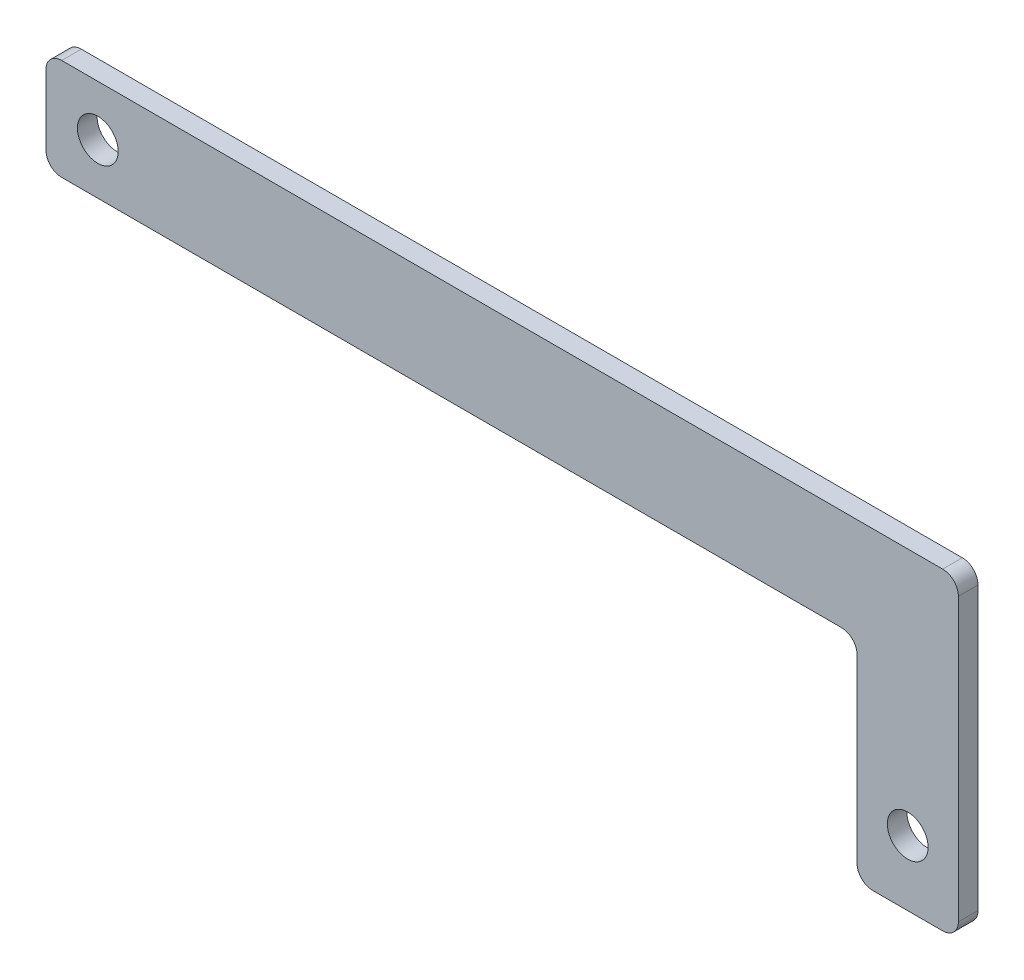
ISO-10303-21;
HEADER;
FILE_DESCRIPTION(('STEP AP214'),'2;1');
FILE_NAME('part.step','',(''),(''),'','','');
FILE_SCHEMA(('AUTOMOTIVE_DESIGN { 1 0 10303 214 1 1 1 1 }'));
ENDSEC;
DATA;
#1=APPLICATION_CONTEXT('core data for automotive mechanical design processes');
#2=APPLICATION_PROTOCOL_DEFINITION('international standard','automotive_design',2000,#1);
#3=PRODUCT_CONTEXT('',#1,'mechanical');
#4=PRODUCT('Part','Part','',(#3));
#5=PRODUCT_RELATED_PRODUCT_CATEGORY('part','',(#4));
#6=PRODUCT_DEFINITION_FORMATION('','',#4);
#7=PRODUCT_DEFINITION_CONTEXT('part definition',#1,'design');
#8=PRODUCT_DEFINITION('design','',#6,#7);
#9=PRODUCT_DEFINITION_SHAPE('','',#8);
#10=(LENGTH_UNIT() NAMED_UNIT(*) SI_UNIT(.MILLI.,.METRE.));
#11=(NAMED_UNIT(*) PLANE_ANGLE_UNIT() SI_UNIT($,.RADIAN.));
#12=(NAMED_UNIT(*) SI_UNIT($,.STERADIAN.) SOLID_ANGLE_UNIT());
#13=UNCERTAINTY_MEASURE_WITH_UNIT(LENGTH_MEASURE(1.E-05),#10,'distance_accuracy_value','');
#14=(GEOMETRIC_REPRESENTATION_CONTEXT(3) GLOBAL_UNCERTAINTY_ASSIGNED_CONTEXT((#13)) GLOBAL_UNIT_ASSIGNED_CONTEXT((#10,
#11,#12)) REPRESENTATION_CONTEXT('',''));
#15=CARTESIAN_POINT('',(0.,0.,0.));
#16=DIRECTION('',(0.,0.,1.));
#17=DIRECTION('',(1.,0.,0.));
#18=AXIS2_PLACEMENT_3D('',#15,#16,#17);
#19=CARTESIAN_POINT('',(-22.7939000000006,-78.501600001231,-3.175));
#20=DIRECTION('',(-1.,0.,0.));
#21=DIRECTION('',(0.,-1.,0.));
#22=AXIS2_PLACEMENT_3D('',#19,#20,#21);
#23=PLANE('',#22);
#24=DIRECTION('',(0.,-1.,0.));
#25=VECTOR('',#24,1.);
#26=CARTESIAN_POINT('',(-22.7939000000006,-78.501600001231,0.));
#27=LINE('',#26,#25);
#28=CARTESIAN_POINT('',(-22.7939000000006,-64.663600001231,0.));
#29=VERTEX_POINT('',#28);
#30=CARTESIAN_POINT('',(-22.7939000000006,-75.961600001231,0.));
#31=VERTEX_POINT('',#30);
#32=EDGE_CURVE('E232',#29,#31,#27,.T.);
#33=ORIENTED_EDGE('',*,*,#32,.F.);
#34=DIRECTION('',(0.,0.,1.));
#35=VECTOR('',#34,1.);
#36=CARTESIAN_POINT('',(-22.7939000000006,-64.663600001231,-3.175));
#37=LINE('',#36,#35);
#38=CARTESIAN_POINT('',(-22.7939000000006,-64.663600001231,-3.175));
#39=VERTEX_POINT('',#38);
#40=EDGE_CURVE('E202',#29,#39,#37,.F.);
#41=ORIENTED_EDGE('',*,*,#40,.T.);
#42=DIRECTION('',(0.,-1.,0.));
#43=VECTOR('',#42,1.);
#44=CARTESIAN_POINT('',(-22.7939000000006,-78.501600001231,-3.175));
#45=LINE('',#44,#43);
#46=CARTESIAN_POINT('',(-22.7939000000006,-75.961600001231,-3.175));
#47=VERTEX_POINT('',#46);
#48=EDGE_CURVE('E221',#39,#47,#45,.T.);
#49=ORIENTED_EDGE('',*,*,#48,.T.);
#50=DIRECTION('',(0.,0.,1.));
#51=VECTOR('',#50,1.);
#52=CARTESIAN_POINT('',(-22.7939000000006,-75.961600001231,-3.175));
#53=LINE('',#52,#51);
#54=EDGE_CURVE('E199',#47,#31,#53,.T.);
#55=ORIENTED_EDGE('',*,*,#54,.T.);
#56=EDGE_LOOP('',(#33,#41,#49,#55));
#57=FACE_BOUND('',#56,.T.);
#58=ADVANCED_FACE('F43',(#57),#23,.T.);
#59=CARTESIAN_POINT('',(124.749719047619,-62.123600001232,-3.175));
#60=DIRECTION('',(0.,1.,0.));
#61=DIRECTION('',(-1.,0.,0.));
#62=AXIS2_PLACEMENT_3D('',#59,#60,#61);
#63=PLANE('',#62);
#64=DIRECTION('',(-1.,0.,0.));
#65=VECTOR('',#64,1.);
#66=CARTESIAN_POINT('',(124.749719047619,-62.123600001232,0.));
#67=LINE('',#66,#65);
#68=CARTESIAN_POINT('',(122.209719047619,-62.123600001232,0.));
#69=VERTEX_POINT('',#68);
#70=CARTESIAN_POINT('',(-20.2539000000005,-62.123600001231,0.));
#71=VERTEX_POINT('',#70);
#72=EDGE_CURVE('E153',#69,#71,#67,.T.);
#73=ORIENTED_EDGE('',*,*,#72,.F.);
#74=DIRECTION('',(0.,0.,1.));
#75=VECTOR('',#74,1.);
#76=CARTESIAN_POINT('',(122.209719047619,-62.123600001232,-3.175));
#77=LINE('',#76,#75);
#78=CARTESIAN_POINT('',(122.209719047619,-62.123600001232,-3.175));
#79=VERTEX_POINT('',#78);
#80=EDGE_CURVE('E175',#69,#79,#77,.F.);
#81=ORIENTED_EDGE('',*,*,#80,.T.);
#82=DIRECTION('',(-1.,0.,0.));
#83=VECTOR('',#82,1.);
#84=CARTESIAN_POINT('',(124.749719047619,-62.123600001232,-3.175));
#85=LINE('',#84,#83);
#86=CARTESIAN_POINT('',(-20.2539000000005,-62.123600001231,-3.175));
#87=VERTEX_POINT('',#86);
#88=EDGE_CURVE('E158',#79,#87,#85,.T.);
#89=ORIENTED_EDGE('',*,*,#88,.T.);
#90=DIRECTION('',(0.,0.,1.));
#91=VECTOR('',#90,1.);
#92=CARTESIAN_POINT('',(-20.2539000000005,-62.123600001231,-3.175));
#93=LINE('',#92,#91);
#94=EDGE_CURVE('E172',#87,#71,#93,.T.);
#95=ORIENTED_EDGE('',*,*,#94,.T.);
#96=EDGE_LOOP('',(#73,#81,#89,#95));
#97=FACE_BOUND('',#96,.T.);
#98=ADVANCED_FACE('F272',(#97),#63,.T.);
#99=CARTESIAN_POINT('',(124.749719047619,-62.123600001232,-3.175));
#100=DIRECTION('',(1.,0.,0.));
#101=DIRECTION('',(0.,0.,-1.));
#102=AXIS2_PLACEMENT_3D('',#99,#100,#101);
#103=PLANE('',#102);
#104=DIRECTION('',(0.,1.,0.));
#105=VECTOR('',#104,1.);
#106=CARTESIAN_POINT('',(124.749719047619,-62.123600001232,-3.175));
#107=LINE('',#106,#105);
#108=CARTESIAN_POINT('',(124.749719047619,-110.251600001232,-3.175));
#109=VERTEX_POINT('',#108);
#110=CARTESIAN_POINT('',(124.749719047619,-64.663600001232,-3.175));
#111=VERTEX_POINT('',#110);
#112=EDGE_CURVE('E163',#109,#111,#107,.T.);
#113=ORIENTED_EDGE('',*,*,#112,.T.);
#114=DIRECTION('',(0.,0.,1.));
#115=VECTOR('',#114,1.);
#116=CARTESIAN_POINT('',(124.749719047619,-64.663600001232,-3.175));
#117=LINE('',#116,#115);
#118=CARTESIAN_POINT('',(124.749719047619,-64.663600001232,0.));
#119=VERTEX_POINT('',#118);
#120=EDGE_CURVE('E152',#111,#119,#117,.T.);
#121=ORIENTED_EDGE('',*,*,#120,.T.);
#122=DIRECTION('',(0.,1.,0.));
#123=VECTOR('',#122,1.);
#124=CARTESIAN_POINT('',(124.749719047619,-62.123600001232,0.));
#125=LINE('',#124,#123);
#126=CARTESIAN_POINT('',(124.749719047619,-110.251600001232,0.));
#127=VERTEX_POINT('',#126);
#128=EDGE_CURVE('E135',#127,#119,#125,.T.);
#129=ORIENTED_EDGE('',*,*,#128,.F.);
#130=DIRECTION('',(0.,0.,1.));
#131=VECTOR('',#130,1.);
#132=CARTESIAN_POINT('',(124.749719047619,-110.251600001232,-3.175));
#133=LINE('',#132,#131);
#134=EDGE_CURVE('E149',#127,#109,#133,.F.);
#135=ORIENTED_EDGE('',*,*,#134,.T.);
#136=EDGE_LOOP('',(#113,#121,#129,#135));
#137=FACE_BOUND('',#136,.T.);
#138=ADVANCED_FACE('F148',(#137),#103,.T.);
#139=CARTESIAN_POINT('',(124.749719047619,-112.791600001232,-3.175));
#140=DIRECTION('',(0.,-1.,0.));
#141=DIRECTION('',(0.,0.,-1.));
#142=AXIS2_PLACEMENT_3D('',#139,#140,#141);
#143=PLANE('',#142);
#144=DIRECTION('',(1.,0.,0.));
#145=VECTOR('',#144,1.);
#146=CARTESIAN_POINT('',(124.749719047619,-112.791600001232,-3.175));
#147=LINE('',#146,#145);
#148=CARTESIAN_POINT('',(110.911719047619,-112.791600001232,-3.175));
#149=VERTEX_POINT('',#148);
#150=CARTESIAN_POINT('',(122.209719047619,-112.791600001232,-3.175));
#151=VERTEX_POINT('',#150);
#152=EDGE_CURVE('E223',#149,#151,#147,.T.);
#153=ORIENTED_EDGE('',*,*,#152,.T.);
#154=DIRECTION('',(0.,0.,1.));
#155=VECTOR('',#154,1.);
#156=CARTESIAN_POINT('',(122.209719047619,-112.791600001232,-3.175));
#157=LINE('',#156,#155);
#158=CARTESIAN_POINT('',(122.209719047619,-112.791600001232,0.));
#159=VERTEX_POINT('',#158);
#160=EDGE_CURVE('E197',#151,#159,#157,.T.);
#161=ORIENTED_EDGE('',*,*,#160,.T.);
#162=DIRECTION('',(1.,0.,0.));
#163=VECTOR('',#162,1.);
#164=CARTESIAN_POINT('',(124.749719047619,-112.791600001232,0.));
#165=LINE('',#164,#163);
#166=CARTESIAN_POINT('',(110.911719047619,-112.791600001232,0.));
#167=VERTEX_POINT('',#166);
#168=EDGE_CURVE('E137',#167,#159,#165,.T.);
#169=ORIENTED_EDGE('',*,*,#168,.F.);
#170=DIRECTION('',(0.,0.,1.));
#171=VECTOR('',#170,1.);
#172=CARTESIAN_POINT('',(110.911719047619,-112.791600001232,-3.175));
#173=LINE('',#172,#171);
#174=EDGE_CURVE('E195',#167,#149,#173,.F.);
#175=ORIENTED_EDGE('',*,*,#174,.T.);
#176=EDGE_LOOP('',(#153,#161,#169,#175));
#177=FACE_BOUND('',#176,.T.);
#178=ADVANCED_FACE('F312',(#177),#143,.T.);
#179=CARTESIAN_POINT('',(108.371719047619,-78.501600001232,-3.175));
#180=DIRECTION('',(-1.,0.,0.));
#181=DIRECTION('',(0.,0.,1.));
#182=AXIS2_PLACEMENT_3D('',#179,#180,#181);
#183=PLANE('',#182);
#184=DIRECTION('',(0.,-1.,0.));
#185=VECTOR('',#184,1.);
#186=CARTESIAN_POINT('',(108.371719047619,-78.501600001232,0.));
#187=LINE('',#186,#185);
#188=CARTESIAN_POINT('',(108.371719047619,-81.041600001232,0.));
#189=VERTEX_POINT('',#188);
#190=CARTESIAN_POINT('',(108.371719047619,-110.251600001232,0.));
#191=VERTEX_POINT('',#190);
#192=EDGE_CURVE('E206',#189,#191,#187,.T.);
#193=ORIENTED_EDGE('',*,*,#192,.F.);
#194=DIRECTION('',(0.,0.,1.));
#195=VECTOR('',#194,1.);
#196=CARTESIAN_POINT('',(108.371719047619,-81.041600001232,-3.175));
#197=LINE('',#196,#195);
#198=CARTESIAN_POINT('',(108.371719047619,-81.041600001232,-3.175));
#199=VERTEX_POINT('',#198);
#200=EDGE_CURVE('E193',#189,#199,#197,.F.);
#201=ORIENTED_EDGE('',*,*,#200,.T.);
#202=DIRECTION('',(0.,-1.,0.));
#203=VECTOR('',#202,1.);
#204=CARTESIAN_POINT('',(108.371719047619,-78.501600001232,-3.175));
#205=LINE('',#204,#203);
#206=CARTESIAN_POINT('',(108.371719047619,-110.251600001232,-3.175));
#207=VERTEX_POINT('',#206);
#208=EDGE_CURVE('E220',#199,#207,#205,.T.);
#209=ORIENTED_EDGE('',*,*,#208,.T.);
#210=DIRECTION('',(0.,0.,1.));
#211=VECTOR('',#210,1.);
#212=CARTESIAN_POINT('',(108.371719047619,-110.251600001232,-3.175));
#213=LINE('',#212,#211);
#214=EDGE_CURVE('E190',#207,#191,#213,.T.);
#215=ORIENTED_EDGE('',*,*,#214,.T.);
#216=EDGE_LOOP('',(#193,#201,#209,#215));
#217=FACE_BOUND('',#216,.T.);
#218=ADVANCED_FACE('F212',(#217),#183,.T.);
#219=CARTESIAN_POINT('',(108.371719047619,-78.501600001232,-3.175));
#220=DIRECTION('',(0.,-1.,0.));
#221=DIRECTION('',(1.,0.,0.));
#222=AXIS2_PLACEMENT_3D('',#219,#220,#221);
#223=PLANE('',#222);
#224=DIRECTION('',(1.,0.,0.));
#225=VECTOR('',#224,1.);
#226=CARTESIAN_POINT('',(108.371719047619,-78.501600001232,-3.175));
#227=LINE('',#226,#225);
#228=CARTESIAN_POINT('',(-20.2539000000006,-78.501600001231,-3.175));
#229=VERTEX_POINT('',#228);
#230=CARTESIAN_POINT('',(105.831719047619,-78.501600001232,-3.175));
#231=VERTEX_POINT('',#230);
#232=EDGE_CURVE('E218',#229,#231,#227,.T.);
#233=ORIENTED_EDGE('',*,*,#232,.T.);
#234=DIRECTION('',(0.,0.,1.));
#235=VECTOR('',#234,1.);
#236=CARTESIAN_POINT('',(105.831719047619,-78.501600001232,0.));
#237=LINE('',#236,#235);
#238=CARTESIAN_POINT('',(105.831719047619,-78.501600001232,0.));
#239=VERTEX_POINT('',#238);
#240=EDGE_CURVE('E187',#231,#239,#237,.T.);
#241=ORIENTED_EDGE('',*,*,#240,.T.);
#242=DIRECTION('',(1.,0.,0.));
#243=VECTOR('',#242,1.);
#244=CARTESIAN_POINT('',(108.371719047619,-78.501600001232,0.));
#245=LINE('',#244,#243);
#246=CARTESIAN_POINT('',(-20.2539000000006,-78.501600001231,0.));
#247=VERTEX_POINT('',#246);
#248=EDGE_CURVE('E207',#247,#239,#245,.T.);
#249=ORIENTED_EDGE('',*,*,#248,.F.);
#250=DIRECTION('',(0.,0.,1.));
#251=VECTOR('',#250,1.);
#252=CARTESIAN_POINT('',(-20.2539000000006,-78.501600001231,-3.175));
#253=LINE('',#252,#251);
#254=EDGE_CURVE('E63',#247,#229,#253,.F.);
#255=ORIENTED_EDGE('',*,*,#254,.T.);
#256=EDGE_LOOP('',(#233,#241,#249,#255));
#257=FACE_BOUND('',#256,.T.);
#258=ADVANCED_FACE('F217',(#257),#223,.T.);
#259=CARTESIAN_POINT('',(0.,0.,-3.175));
#260=DIRECTION('',(0.,0.,1.));
#261=DIRECTION('',(1.,0.,0.));
#262=AXIS2_PLACEMENT_3D('',#259,#260,#261);
#263=PLANE('',#262);
#264=CARTESIAN_POINT('',(-14.4119000000007,-70.312600001232,-3.175));
#265=DIRECTION('',(0.,0.,1.));
#266=DIRECTION('',(1.,0.,0.));
#267=AXIS2_PLACEMENT_3D('',#264,#265,#266);
#268=CIRCLE('',#267,3.3);
#269=CARTESIAN_POINT('',(-11.1119000000007,-70.312600001232,-3.175));
#270=VERTEX_POINT('',#269);
#271=EDGE_CURVE('E243',#270,#270,#268,.T.);
#272=ORIENTED_EDGE('',*,*,#271,.T.);
#273=EDGE_LOOP('',(#272));
#274=FACE_BOUND('',#273,.T.);
#275=CARTESIAN_POINT('',(116.56071904762,-102.268610497745,-3.175));
#276=DIRECTION('',(0.,0.,1.));
#277=DIRECTION('',(1.,0.,0.));
#278=AXIS2_PLACEMENT_3D('',#275,#276,#277);
#279=CIRCLE('',#278,3.3);
#280=CARTESIAN_POINT('',(119.86071904762,-102.268610497745,-3.175));
#281=VERTEX_POINT('',#280);
#282=EDGE_CURVE('E235',#281,#281,#279,.T.);
#283=ORIENTED_EDGE('',*,*,#282,.T.);
#284=EDGE_LOOP('',(#283));
#285=FACE_BOUND('',#284,.T.);
#286=ORIENTED_EDGE('',*,*,#88,.F.);
#287=CARTESIAN_POINT('',(122.209719047619,-64.663600001232,-3.175));
#288=DIRECTION('',(0.,0.,1.));
#289=DIRECTION('',(1.,0.,0.));
#290=AXIS2_PLACEMENT_3D('',#287,#288,#289);
#291=CIRCLE('',#290,2.54);
#292=EDGE_CURVE('E184',#79,#111,#291,.F.);
#293=ORIENTED_EDGE('',*,*,#292,.T.);
#294=ORIENTED_EDGE('',*,*,#112,.F.);
#295=CARTESIAN_POINT('',(122.209719047619,-110.251600001232,-3.175));
#296=DIRECTION('',(0.,0.,1.));
#297=DIRECTION('',(1.,0.,0.));
#298=AXIS2_PLACEMENT_3D('',#295,#296,#297);
#299=CIRCLE('',#298,2.54);
#300=EDGE_CURVE('E157',#109,#151,#299,.F.);
#301=ORIENTED_EDGE('',*,*,#300,.T.);
#302=ORIENTED_EDGE('',*,*,#152,.F.);
#303=CARTESIAN_POINT('',(110.911719047619,-110.251600001232,-3.175));
#304=DIRECTION('',(0.,0.,1.));
#305=DIRECTION('',(1.,0.,0.));
#306=AXIS2_PLACEMENT_3D('',#303,#304,#305);
#307=CIRCLE('',#306,2.54);
#308=EDGE_CURVE('E181',#149,#207,#307,.F.);
#309=ORIENTED_EDGE('',*,*,#308,.T.);
#310=ORIENTED_EDGE('',*,*,#208,.F.);
#311=CARTESIAN_POINT('',(105.831719047619,-81.041600001232,-3.175));
#312=DIRECTION('',(0.,0.,1.));
#313=DIRECTION('',(1.,0.,0.));
#314=AXIS2_PLACEMENT_3D('',#311,#312,#313);
#315=CIRCLE('',#314,2.54);
#316=EDGE_CURVE('E11',#199,#231,#315,.T.);
#317=ORIENTED_EDGE('',*,*,#316,.T.);
#318=ORIENTED_EDGE('',*,*,#232,.F.);
#319=CARTESIAN_POINT('',(-20.2539000000006,-75.961600001231,-3.175));
#320=DIRECTION('',(0.,0.,1.));
#321=DIRECTION('',(1.,0.,0.));
#322=AXIS2_PLACEMENT_3D('',#319,#320,#321);
#323=CIRCLE('',#322,2.54);
#324=EDGE_CURVE('E177',#229,#47,#323,.F.);
#325=ORIENTED_EDGE('',*,*,#324,.T.);
#326=ORIENTED_EDGE('',*,*,#48,.F.);
#327=CARTESIAN_POINT('',(-20.2539000000006,-64.663600001231,-3.175));
#328=DIRECTION('',(0.,0.,1.));
#329=DIRECTION('',(1.,0.,0.));
#330=AXIS2_PLACEMENT_3D('',#327,#328,#329);
#331=CIRCLE('',#330,2.54);
#332=EDGE_CURVE('E179',#39,#87,#331,.F.);
#333=ORIENTED_EDGE('',*,*,#332,.T.);
#334=EDGE_LOOP('',(#286,#293,#294,#301,#302,#309,#310,#317,#318,#325,#326,#333));
#335=FACE_BOUND('',#334,.T.);
#336=ADVANCED_FACE('F257',(#274,#285,#335),#263,.F.);
#337=CARTESIAN_POINT('',(0.,0.,0.));
#338=DIRECTION('',(0.,0.,1.));
#339=DIRECTION('',(1.,0.,0.));
#340=AXIS2_PLACEMENT_3D('',#337,#338,#339);
#341=PLANE('',#340);
#342=CARTESIAN_POINT('',(-14.4119000000007,-70.312600001232,0.));
#343=DIRECTION('',(0.,0.,1.));
#344=DIRECTION('',(1.,0.,0.));
#345=AXIS2_PLACEMENT_3D('',#342,#343,#344);
#346=CIRCLE('',#345,3.3);
#347=CARTESIAN_POINT('',(-11.1119000000007,-70.312600001232,0.));
#348=VERTEX_POINT('',#347);
#349=EDGE_CURVE('E248',#348,#348,#346,.T.);
#350=ORIENTED_EDGE('',*,*,#349,.F.);
#351=EDGE_LOOP('',(#350));
#352=FACE_BOUND('',#351,.T.);
#353=CARTESIAN_POINT('',(116.56071904762,-102.268610497745,0.));
#354=DIRECTION('',(0.,0.,1.));
#355=DIRECTION('',(1.,0.,0.));
#356=AXIS2_PLACEMENT_3D('',#353,#354,#355);
#357=CIRCLE('',#356,3.3);
#358=CARTESIAN_POINT('',(119.86071904762,-102.268610497745,0.));
#359=VERTEX_POINT('',#358);
#360=EDGE_CURVE('E239',#359,#359,#357,.T.);
#361=ORIENTED_EDGE('',*,*,#360,.F.);
#362=EDGE_LOOP('',(#361));
#363=FACE_BOUND('',#362,.T.);
#364=ORIENTED_EDGE('',*,*,#128,.T.);
#365=CARTESIAN_POINT('',(122.209719047619,-64.663600001232,0.));
#366=DIRECTION('',(0.,0.,1.));
#367=DIRECTION('',(1.,0.,0.));
#368=AXIS2_PLACEMENT_3D('',#365,#366,#367);
#369=CIRCLE('',#368,2.54);
#370=EDGE_CURVE('E142',#119,#69,#369,.T.);
#371=ORIENTED_EDGE('',*,*,#370,.T.);
#372=ORIENTED_EDGE('',*,*,#72,.T.);
#373=CARTESIAN_POINT('',(-20.2539000000006,-64.663600001231,0.));
#374=DIRECTION('',(0.,0.,1.));
#375=DIRECTION('',(1.,0.,0.));
#376=AXIS2_PLACEMENT_3D('',#373,#374,#375);
#377=CIRCLE('',#376,2.54);
#378=EDGE_CURVE('E168',#71,#29,#377,.T.);
#379=ORIENTED_EDGE('',*,*,#378,.T.);
#380=ORIENTED_EDGE('',*,*,#32,.T.);
#381=CARTESIAN_POINT('',(-20.2539000000006,-75.961600001231,0.));
#382=DIRECTION('',(0.,0.,1.));
#383=DIRECTION('',(1.,0.,0.));
#384=AXIS2_PLACEMENT_3D('',#381,#382,#383);
#385=CIRCLE('',#384,2.54);
#386=EDGE_CURVE('E160',#31,#247,#385,.T.);
#387=ORIENTED_EDGE('',*,*,#386,.T.);
#388=ORIENTED_EDGE('',*,*,#248,.T.);
#389=CARTESIAN_POINT('',(105.831719047619,-81.041600001232,0.));
#390=DIRECTION('',(0.,0.,1.));
#391=DIRECTION('',(1.,0.,0.));
#392=AXIS2_PLACEMENT_3D('',#389,#390,#391);
#393=CIRCLE('',#392,2.54);
#394=EDGE_CURVE('E51',#239,#189,#393,.F.);
#395=ORIENTED_EDGE('',*,*,#394,.T.);
#396=ORIENTED_EDGE('',*,*,#192,.T.);
#397=CARTESIAN_POINT('',(110.911719047619,-110.251600001232,0.));
#398=DIRECTION('',(0.,0.,1.));
#399=DIRECTION('',(1.,0.,0.));
#400=AXIS2_PLACEMENT_3D('',#397,#398,#399);
#401=CIRCLE('',#400,2.54);
#402=EDGE_CURVE('E143',#191,#167,#401,.T.);
#403=ORIENTED_EDGE('',*,*,#402,.T.);
#404=ORIENTED_EDGE('',*,*,#168,.T.);
#405=CARTESIAN_POINT('',(122.209719047619,-110.251600001232,0.));
#406=DIRECTION('',(0.,0.,1.));
#407=DIRECTION('',(1.,0.,0.));
#408=AXIS2_PLACEMENT_3D('',#405,#406,#407);
#409=CIRCLE('',#408,2.54);
#410=EDGE_CURVE('E132',#159,#127,#409,.T.);
#411=ORIENTED_EDGE('',*,*,#410,.T.);
#412=EDGE_LOOP('',(#364,#371,#372,#379,#380,#387,#388,#395,#396,#403,#404,#411));
#413=FACE_BOUND('',#412,.T.);
#414=ADVANCED_FACE('F134',(#352,#363,#413),#341,.T.);
#415=CARTESIAN_POINT('',(116.56071904762,-102.268610497745,0.));
#416=DIRECTION('',(0.,0.,1.));
#417=DIRECTION('',(1.,0.,0.));
#418=AXIS2_PLACEMENT_3D('',#415,#416,#417);
#419=CYLINDRICAL_SURFACE('',#418,3.3);
#420=ORIENTED_EDGE('',*,*,#282,.F.);
#421=EDGE_LOOP('',(#420));
#422=FACE_BOUND('',#421,.T.);
#423=ORIENTED_EDGE('',*,*,#360,.T.);
#424=EDGE_LOOP('',(#423));
#425=FACE_BOUND('',#424,.T.);
#426=ADVANCED_FACE('F256',(#422,#425),#419,.F.);
#427=CARTESIAN_POINT('',(-14.4119000000007,-70.312600001232,0.));
#428=DIRECTION('',(0.,0.,1.));
#429=DIRECTION('',(1.,0.,0.));
#430=AXIS2_PLACEMENT_3D('',#427,#428,#429);
#431=CYLINDRICAL_SURFACE('',#430,3.3);
#432=ORIENTED_EDGE('',*,*,#271,.F.);
#433=EDGE_LOOP('',(#432));
#434=FACE_BOUND('',#433,.T.);
#435=ORIENTED_EDGE('',*,*,#349,.T.);
#436=EDGE_LOOP('',(#435));
#437=FACE_BOUND('',#436,.T.);
#438=ADVANCED_FACE('F252',(#434,#437),#431,.F.);
#439=CARTESIAN_POINT('',(122.209719047619,-64.663600001232,-3.175));
#440=DIRECTION('',(0.,0.,1.));
#441=DIRECTION('',(1.,0.,0.));
#442=AXIS2_PLACEMENT_3D('',#439,#440,#441);
#443=CYLINDRICAL_SURFACE('',#442,2.54);
#444=ORIENTED_EDGE('',*,*,#292,.F.);
#445=ORIENTED_EDGE('',*,*,#80,.F.);
#446=ORIENTED_EDGE('',*,*,#370,.F.);
#447=ORIENTED_EDGE('',*,*,#120,.F.);
#448=EDGE_LOOP('',(#444,#445,#446,#447));
#449=FACE_BOUND('',#448,.T.);
#450=ADVANCED_FACE('F267',(#449),#443,.T.);
#451=CARTESIAN_POINT('',(105.831719047619,-81.041600001232,-3.175));
#452=DIRECTION('',(0.,0.,-1.));
#453=DIRECTION('',(-1.,0.,0.));
#454=AXIS2_PLACEMENT_3D('',#451,#452,#453);
#455=CYLINDRICAL_SURFACE('',#454,2.54);
#456=ORIENTED_EDGE('',*,*,#316,.F.);
#457=ORIENTED_EDGE('',*,*,#200,.F.);
#458=ORIENTED_EDGE('',*,*,#394,.F.);
#459=ORIENTED_EDGE('',*,*,#240,.F.);
#460=EDGE_LOOP('',(#456,#457,#458,#459));
#461=FACE_BOUND('',#460,.T.);
#462=ADVANCED_FACE('F216',(#461),#455,.F.);
#463=CARTESIAN_POINT('',(122.209719047619,-110.251600001232,-3.175));
#464=DIRECTION('',(0.,0.,1.));
#465=DIRECTION('',(1.,0.,0.));
#466=AXIS2_PLACEMENT_3D('',#463,#464,#465);
#467=CYLINDRICAL_SURFACE('',#466,2.54);
#468=ORIENTED_EDGE('',*,*,#300,.F.);
#469=ORIENTED_EDGE('',*,*,#134,.F.);
#470=ORIENTED_EDGE('',*,*,#410,.F.);
#471=ORIENTED_EDGE('',*,*,#160,.F.);
#472=EDGE_LOOP('',(#468,#469,#470,#471));
#473=FACE_BOUND('',#472,.T.);
#474=ADVANCED_FACE('F156',(#473),#467,.T.);
#475=CARTESIAN_POINT('',(110.911719047619,-110.251600001232,-3.175));
#476=DIRECTION('',(0.,0.,1.));
#477=DIRECTION('',(1.,0.,0.));
#478=AXIS2_PLACEMENT_3D('',#475,#476,#477);
#479=CYLINDRICAL_SURFACE('',#478,2.54);
#480=ORIENTED_EDGE('',*,*,#308,.F.);
#481=ORIENTED_EDGE('',*,*,#174,.F.);
#482=ORIENTED_EDGE('',*,*,#402,.F.);
#483=ORIENTED_EDGE('',*,*,#214,.F.);
#484=EDGE_LOOP('',(#480,#481,#482,#483));
#485=FACE_BOUND('',#484,.T.);
#486=ADVANCED_FACE('F290',(#485),#479,.T.);
#487=CARTESIAN_POINT('',(-20.2539000000006,-64.663600001231,-3.175));
#488=DIRECTION('',(0.,0.,1.));
#489=DIRECTION('',(1.,0.,0.));
#490=AXIS2_PLACEMENT_3D('',#487,#488,#489);
#491=CYLINDRICAL_SURFACE('',#490,2.54);
#492=ORIENTED_EDGE('',*,*,#332,.F.);
#493=ORIENTED_EDGE('',*,*,#40,.F.);
#494=ORIENTED_EDGE('',*,*,#378,.F.);
#495=ORIENTED_EDGE('',*,*,#94,.F.);
#496=EDGE_LOOP('',(#492,#493,#494,#495));
#497=FACE_BOUND('',#496,.T.);
#498=ADVANCED_FACE('F292',(#497),#491,.T.);
#499=CARTESIAN_POINT('',(-20.2539000000006,-75.961600001231,-3.175));
#500=DIRECTION('',(0.,0.,1.));
#501=DIRECTION('',(1.,0.,0.));
#502=AXIS2_PLACEMENT_3D('',#499,#500,#501);
#503=CYLINDRICAL_SURFACE('',#502,2.54);
#504=ORIENTED_EDGE('',*,*,#324,.F.);
#505=ORIENTED_EDGE('',*,*,#254,.F.);
#506=ORIENTED_EDGE('',*,*,#386,.F.);
#507=ORIENTED_EDGE('',*,*,#54,.F.);
#508=EDGE_LOOP('',(#504,#505,#506,#507));
#509=FACE_BOUND('',#508,.T.);
#510=ADVANCED_FACE('F45',(#509),#503,.T.);
#511=CLOSED_SHELL('',(#58,#98,#138,#178,#218,#258,#336,#414,#426,#438,#450,#462,#474,#486,#498,#510));
#512=MANIFOLD_SOLID_BREP('B2',#511);
#513=ADVANCED_BREP_SHAPE_REPRESENTATION('',(#18,#512),#14);
#514=SHAPE_DEFINITION_REPRESENTATION(#9,#513);
ENDSEC;
END-ISO-10303-21;
